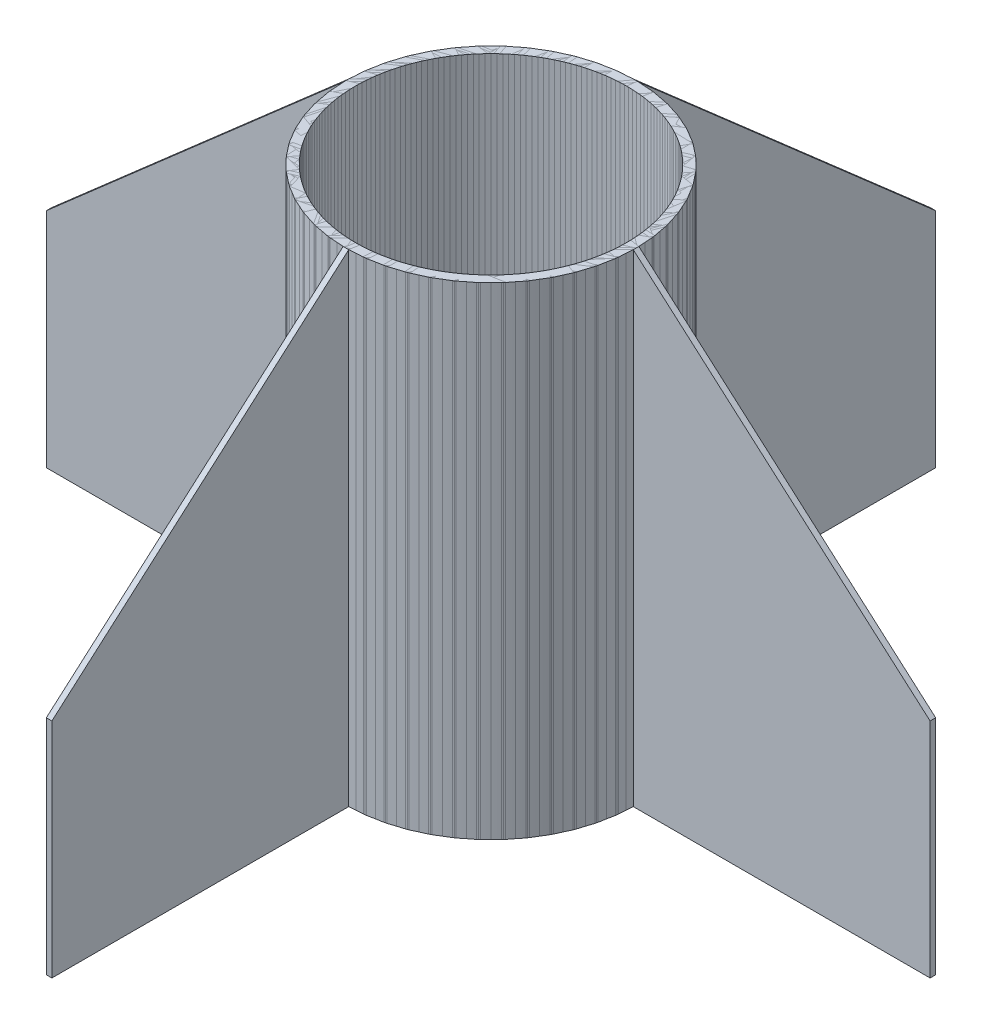
ISO-10303-21;
HEADER;
FILE_DESCRIPTION(('STEP AP214'),'2;1');
FILE_NAME('part.step','',(''),(''),'','','');
FILE_SCHEMA(('AUTOMOTIVE_DESIGN { 1 0 10303 214 1 1 1 1 }'));
ENDSEC;
DATA;
#1=APPLICATION_CONTEXT('core data for automotive mechanical design processes');
#2=APPLICATION_PROTOCOL_DEFINITION('international standard','automotive_design',2000,#1);
#3=PRODUCT_CONTEXT('',#1,'mechanical');
#4=PRODUCT('Part','Part','',(#3));
#5=PRODUCT_RELATED_PRODUCT_CATEGORY('part','',(#4));
#6=PRODUCT_DEFINITION_FORMATION('','',#4);
#7=PRODUCT_DEFINITION_CONTEXT('part definition',#1,'design');
#8=PRODUCT_DEFINITION('design','',#6,#7);
#9=PRODUCT_DEFINITION_SHAPE('','',#8);
#10=(LENGTH_UNIT() NAMED_UNIT(*) SI_UNIT(.MILLI.,.METRE.));
#11=(NAMED_UNIT(*) PLANE_ANGLE_UNIT() SI_UNIT($,.RADIAN.));
#12=(NAMED_UNIT(*) SI_UNIT($,.STERADIAN.) SOLID_ANGLE_UNIT());
#13=UNCERTAINTY_MEASURE_WITH_UNIT(LENGTH_MEASURE(1.E-05),#10,'distance_accuracy_value','');
#14=(GEOMETRIC_REPRESENTATION_CONTEXT(3) GLOBAL_UNCERTAINTY_ASSIGNED_CONTEXT((#13)) GLOBAL_UNIT_ASSIGNED_CONTEXT((#10,
#11,#12)) REPRESENTATION_CONTEXT('',''));
#15=CARTESIAN_POINT('',(0.,0.,0.));
#16=DIRECTION('',(0.,0.,1.));
#17=DIRECTION('',(1.,0.,0.));
#18=AXIS2_PLACEMENT_3D('',#15,#16,#17);
#19=CARTESIAN_POINT('',(0.,260.,0.));
#20=DIRECTION('',(0.,-1.,0.));
#21=DIRECTION('',(-1.,0.,0.));
#22=AXIS2_PLACEMENT_3D('',#19,#20,#21);
#23=CYLINDRICAL_SURFACE('',#22,78.2);
#24=DIRECTION('',(0.,-1.,0.));
#25=VECTOR('',#24,1.);
#26=CARTESIAN_POINT('',(-1.49999999999918,260.,-78.1856124872089));
#27=LINE('',#26,#25);
#28=CARTESIAN_POINT('',(-1.49999999999918,0.,-78.1856124872089));
#29=VERTEX_POINT('',#28);
#30=CARTESIAN_POINT('',(-1.49999999999918,260.,-78.1856124872089));
#31=VERTEX_POINT('',#30);
#32=EDGE_CURVE('E12',#29,#31,#27,.F.);
#33=ORIENTED_EDGE('',*,*,#32,.F.);
#34=CARTESIAN_POINT('',(0.,0.,0.));
#35=DIRECTION('',(0.,1.,0.));
#36=DIRECTION('',(1.,0.,0.));
#37=AXIS2_PLACEMENT_3D('',#34,#35,#36);
#38=CIRCLE('',#37,78.2);
#39=CARTESIAN_POINT('',(1.50000000000082,0.,-78.1856124872089));
#40=VERTEX_POINT('',#39);
#41=EDGE_CURVE('E131',#29,#40,#38,.T.);
#42=ORIENTED_EDGE('',*,*,#41,.T.);
#43=DIRECTION('',(0.,-1.,0.));
#44=VECTOR('',#43,1.);
#45=CARTESIAN_POINT('',(1.50000000000082,260.,-78.1856124872089));
#46=LINE('',#45,#44);
#47=CARTESIAN_POINT('',(1.50000000000082,260.,-78.1856124872089));
#48=VERTEX_POINT('',#47);
#49=EDGE_CURVE('E53',#40,#48,#46,.F.);
#50=ORIENTED_EDGE('',*,*,#49,.T.);
#51=CARTESIAN_POINT('',(0.,260.,0.));
#52=DIRECTION('',(0.,1.,0.));
#53=DIRECTION('',(1.,0.,0.));
#54=AXIS2_PLACEMENT_3D('',#51,#52,#53);
#55=CIRCLE('',#54,78.2);
#56=EDGE_CURVE('E134',#31,#48,#55,.T.);
#57=ORIENTED_EDGE('',*,*,#56,.F.);
#58=EDGE_LOOP('',(#33,#42,#50,#57));
#59=FACE_BOUND('',#58,.T.);
#60=ADVANCED_FACE('F46',(#59),#23,.T.);
#61=CARTESIAN_POINT('',(0.,260.,0.));
#62=DIRECTION('',(0.,1.,0.));
#63=DIRECTION('',(1.,0.,0.));
#64=AXIS2_PLACEMENT_3D('',#61,#62,#63);
#65=PLANE('',#64);
#66=DIRECTION('',(0.,0.,1.));
#67=VECTOR('',#66,1.);
#68=CARTESIAN_POINT('',(-1.49999999999918,260.,-78.2));
#69=LINE('',#68,#67);
#70=CARTESIAN_POINT('',(-1.49999999999918,260.,-78.2));
#71=VERTEX_POINT('',#70);
#72=EDGE_CURVE('E99',#71,#31,#69,.T.);
#73=ORIENTED_EDGE('',*,*,#72,.T.);
#74=ORIENTED_EDGE('',*,*,#56,.T.);
#75=DIRECTION('',(0.,0.,1.));
#76=VECTOR('',#75,1.);
#77=CARTESIAN_POINT('',(1.50000000000082,260.,-78.2));
#78=LINE('',#77,#76);
#79=CARTESIAN_POINT('',(1.50000000000082,260.,-78.2));
#80=VERTEX_POINT('',#79);
#81=EDGE_CURVE('E60',#80,#48,#78,.T.);
#82=ORIENTED_EDGE('',*,*,#81,.F.);
#83=DIRECTION('',(1.,0.,0.));
#84=VECTOR('',#83,1.);
#85=CARTESIAN_POINT('',(-1.49999999999918,260.,-78.2));
#86=LINE('',#85,#84);
#87=EDGE_CURVE('E124',#71,#80,#86,.T.);
#88=ORIENTED_EDGE('',*,*,#87,.F.);
#89=EDGE_LOOP('',(#73,#74,#82,#88));
#90=FACE_BOUND('',#89,.T.);
#91=CARTESIAN_POINT('',(0.,260.,0.));
#92=DIRECTION('',(0.,1.,0.));
#93=DIRECTION('',(1.,0.,0.));
#94=AXIS2_PLACEMENT_3D('',#91,#92,#93);
#95=CIRCLE('',#94,73.2);
#96=CARTESIAN_POINT('',(73.2,260.,7.66729302009952E-13));
#97=VERTEX_POINT('',#96);
#98=EDGE_CURVE('E128',#97,#97,#95,.T.);
#99=ORIENTED_EDGE('',*,*,#98,.F.);
#100=EDGE_LOOP('',(#99));
#101=FACE_BOUND('',#100,.T.);
#102=ADVANCED_FACE('F140',(#90,#101),#65,.T.);
#103=CARTESIAN_POINT('',(0.,0.,0.));
#104=DIRECTION('',(0.,1.,0.));
#105=DIRECTION('',(1.,0.,0.));
#106=AXIS2_PLACEMENT_3D('',#103,#104,#105);
#107=PLANE('',#106);
#108=ORIENTED_EDGE('',*,*,#41,.F.);
#109=DIRECTION('',(0.,0.,-1.));
#110=VECTOR('',#109,1.);
#111=CARTESIAN_POINT('',(-1.4999999999992,0.,-76.2));
#112=LINE('',#111,#110);
#113=CARTESIAN_POINT('',(-1.49999999999751,0.,-238.2));
#114=VERTEX_POINT('',#113);
#115=EDGE_CURVE('E67',#29,#114,#112,.T.);
#116=ORIENTED_EDGE('',*,*,#115,.T.);
#117=DIRECTION('',(1.,0.,0.));
#118=VECTOR('',#117,1.);
#119=CARTESIAN_POINT('',(-1.49999999999751,0.,-238.2));
#120=LINE('',#119,#118);
#121=CARTESIAN_POINT('',(1.50000000000249,0.,-238.2));
#122=VERTEX_POINT('',#121);
#123=EDGE_CURVE('E102',#114,#122,#120,.T.);
#124=ORIENTED_EDGE('',*,*,#123,.T.);
#125=DIRECTION('',(0.,0.,-1.));
#126=VECTOR('',#125,1.);
#127=CARTESIAN_POINT('',(1.5000000000008,0.,-76.2));
#128=LINE('',#127,#126);
#129=EDGE_CURVE('E90',#40,#122,#128,.T.);
#130=ORIENTED_EDGE('',*,*,#129,.F.);
#131=EDGE_LOOP('',(#108,#116,#124,#130));
#132=FACE_BOUND('',#131,.T.);
#133=CARTESIAN_POINT('',(0.,0.,0.));
#134=DIRECTION('',(0.,1.,0.));
#135=DIRECTION('',(1.,0.,0.));
#136=AXIS2_PLACEMENT_3D('',#133,#134,#135);
#137=CIRCLE('',#136,73.2);
#138=CARTESIAN_POINT('',(73.2,0.,7.66729302009952E-13));
#139=VERTEX_POINT('',#138);
#140=EDGE_CURVE('E127',#139,#139,#137,.T.);
#141=ORIENTED_EDGE('',*,*,#140,.T.);
#142=EDGE_LOOP('',(#141));
#143=FACE_BOUND('',#142,.T.);
#144=ADVANCED_FACE('F103',(#132,#143),#107,.F.);
#145=CARTESIAN_POINT('',(0.,260.,0.));
#146=DIRECTION('',(0.,-1.,0.));
#147=DIRECTION('',(-1.,0.,0.));
#148=AXIS2_PLACEMENT_3D('',#145,#146,#147);
#149=CYLINDRICAL_SURFACE('',#148,73.2);
#150=ORIENTED_EDGE('',*,*,#98,.T.);
#151=EDGE_LOOP('',(#150));
#152=FACE_BOUND('',#151,.T.);
#153=ORIENTED_EDGE('',*,*,#140,.F.);
#154=EDGE_LOOP('',(#153));
#155=FACE_BOUND('',#154,.T.);
#156=ADVANCED_FACE('F163',(#152,#155),#149,.F.);
#157=CARTESIAN_POINT('',(-1.5,0.,0.));
#158=DIRECTION('',(1.,0.,0.));
#159=DIRECTION('',(0.,0.,-1.));
#160=AXIS2_PLACEMENT_3D('',#157,#158,#159);
#161=PLANE('',#160);
#162=ORIENTED_EDGE('',*,*,#115,.F.);
#163=ORIENTED_EDGE('',*,*,#32,.T.);
#164=ORIENTED_EDGE('',*,*,#72,.F.);
#165=DIRECTION('',(0.,0.658504607868518,0.752576694706878));
#166=VECTOR('',#165,1.);
#167=CARTESIAN_POINT('',(-1.49999999999751,120.,-238.2));
#168=LINE('',#167,#166);
#169=CARTESIAN_POINT('',(-1.49999999999751,120.,-238.2));
#170=VERTEX_POINT('',#169);
#171=EDGE_CURVE('E108',#170,#71,#168,.T.);
#172=ORIENTED_EDGE('',*,*,#171,.F.);
#173=DIRECTION('',(0.,1.,0.));
#174=VECTOR('',#173,1.);
#175=CARTESIAN_POINT('',(-1.49999999999751,0.,-238.2));
#176=LINE('',#175,#174);
#177=EDGE_CURVE('E113',#114,#170,#176,.T.);
#178=ORIENTED_EDGE('',*,*,#177,.F.);
#179=EDGE_LOOP('',(#162,#163,#164,#172,#178));
#180=FACE_BOUND('',#179,.T.);
#181=ADVANCED_FACE('F144',(#180),#161,.F.);
#182=CARTESIAN_POINT('',(1.5,0.,0.));
#183=DIRECTION('',(1.,0.,0.));
#184=DIRECTION('',(0.,0.,-1.));
#185=AXIS2_PLACEMENT_3D('',#182,#183,#184);
#186=PLANE('',#185);
#187=ORIENTED_EDGE('',*,*,#49,.F.);
#188=ORIENTED_EDGE('',*,*,#129,.T.);
#189=DIRECTION('',(0.,1.,0.));
#190=VECTOR('',#189,1.);
#191=CARTESIAN_POINT('',(1.50000000000249,0.,-238.2));
#192=LINE('',#191,#190);
#193=CARTESIAN_POINT('',(1.50000000000249,120.,-238.2));
#194=VERTEX_POINT('',#193);
#195=EDGE_CURVE('E94',#122,#194,#192,.T.);
#196=ORIENTED_EDGE('',*,*,#195,.T.);
#197=DIRECTION('',(0.,0.658504607868518,0.752576694706878));
#198=VECTOR('',#197,1.);
#199=CARTESIAN_POINT('',(1.50000000000249,120.,-238.2));
#200=LINE('',#199,#198);
#201=EDGE_CURVE('E111',#194,#80,#200,.T.);
#202=ORIENTED_EDGE('',*,*,#201,.T.);
#203=ORIENTED_EDGE('',*,*,#81,.T.);
#204=EDGE_LOOP('',(#187,#188,#196,#202,#203));
#205=FACE_BOUND('',#204,.T.);
#206=ADVANCED_FACE('F92',(#205),#186,.T.);
#207=CARTESIAN_POINT('',(-1.49999999999751,120.,-238.2));
#208=DIRECTION('',(0.,0.752576694706878,-0.658504607868518));
#209=DIRECTION('',(0.,0.658504607868518,0.752576694706878));
#210=AXIS2_PLACEMENT_3D('',#207,#208,#209);
#211=PLANE('',#210);
#212=ORIENTED_EDGE('',*,*,#87,.T.);
#213=ORIENTED_EDGE('',*,*,#201,.F.);
#214=DIRECTION('',(1.,0.,0.));
#215=VECTOR('',#214,1.);
#216=CARTESIAN_POINT('',(-1.49999999999751,120.,-238.2));
#217=LINE('',#216,#215);
#218=EDGE_CURVE('E107',#170,#194,#217,.T.);
#219=ORIENTED_EDGE('',*,*,#218,.F.);
#220=ORIENTED_EDGE('',*,*,#171,.T.);
#221=EDGE_LOOP('',(#212,#213,#219,#220));
#222=FACE_BOUND('',#221,.T.);
#223=ADVANCED_FACE('F146',(#222),#211,.T.);
#224=CARTESIAN_POINT('',(-1.49999999999751,0.,-238.2));
#225=DIRECTION('',(0.,0.,-1.));
#226=DIRECTION('',(-1.,0.,0.));
#227=AXIS2_PLACEMENT_3D('',#224,#225,#226);
#228=PLANE('',#227);
#229=ORIENTED_EDGE('',*,*,#218,.T.);
#230=ORIENTED_EDGE('',*,*,#195,.F.);
#231=ORIENTED_EDGE('',*,*,#123,.F.);
#232=ORIENTED_EDGE('',*,*,#177,.T.);
#233=EDGE_LOOP('',(#229,#230,#231,#232));
#234=FACE_BOUND('',#233,.T.);
#235=ADVANCED_FACE('F110',(#234),#228,.T.);
#236=CLOSED_SHELL('',(#60,#102,#144,#156,#181,#206,#223,#235));
#237=MANIFOLD_SOLID_BREP('B2',#236);
#238=CARTESIAN_POINT('',(0.,260.,0.));
#239=DIRECTION('',(0.,-1.,0.));
#240=DIRECTION('',(0.,0.,1.));
#241=AXIS2_PLACEMENT_3D('',#238,#239,#240);
#242=CYLINDRICAL_SURFACE('',#241,78.2);
#243=DIRECTION('',(0.,-1.,0.));
#244=VECTOR('',#243,1.);
#245=CARTESIAN_POINT('',(-78.1856124872089,260.,1.5));
#246=LINE('',#245,#244);
#247=CARTESIAN_POINT('',(-78.1856124872089,0.,1.5));
#248=VERTEX_POINT('',#247);
#249=CARTESIAN_POINT('',(-78.1856124872089,260.,1.5));
#250=VERTEX_POINT('',#249);
#251=EDGE_CURVE('E44',#248,#250,#246,.F.);
#252=ORIENTED_EDGE('',*,*,#251,.F.);
#253=CARTESIAN_POINT('',(0.,0.,0.));
#254=DIRECTION('',(0.,1.,0.));
#255=DIRECTION('',(0.,0.,-1.));
#256=AXIS2_PLACEMENT_3D('',#253,#254,#255);
#257=CIRCLE('',#256,78.2);
#258=CARTESIAN_POINT('',(-78.1856124872089,0.,-1.5));
#259=VERTEX_POINT('',#258);
#260=EDGE_CURVE('E327',#248,#259,#257,.T.);
#261=ORIENTED_EDGE('',*,*,#260,.T.);
#262=DIRECTION('',(0.,-1.,0.));
#263=VECTOR('',#262,1.);
#264=CARTESIAN_POINT('',(-78.1856124872089,260.,-1.5));
#265=LINE('',#264,#263);
#266=CARTESIAN_POINT('',(-78.1856124872089,260.,-1.5));
#267=VERTEX_POINT('',#266);
#268=EDGE_CURVE('E249',#259,#267,#265,.F.);
#269=ORIENTED_EDGE('',*,*,#268,.T.);
#270=CARTESIAN_POINT('',(0.,260.,0.));
#271=DIRECTION('',(0.,1.,0.));
#272=DIRECTION('',(0.,0.,-1.));
#273=AXIS2_PLACEMENT_3D('',#270,#271,#272);
#274=CIRCLE('',#273,78.2);
#275=EDGE_CURVE('E330',#250,#267,#274,.T.);
#276=ORIENTED_EDGE('',*,*,#275,.F.);
#277=EDGE_LOOP('',(#252,#261,#269,#276));
#278=FACE_BOUND('',#277,.T.);
#279=ADVANCED_FACE('F242',(#278),#242,.T.);
#280=CARTESIAN_POINT('',(0.,260.,0.));
#281=DIRECTION('',(0.,1.,0.));
#282=DIRECTION('',(0.,0.,-1.));
#283=AXIS2_PLACEMENT_3D('',#280,#281,#282);
#284=PLANE('',#283);
#285=DIRECTION('',(1.,0.,0.));
#286=VECTOR('',#285,1.);
#287=CARTESIAN_POINT('',(-78.2,260.,1.5));
#288=LINE('',#287,#286);
#289=CARTESIAN_POINT('',(-78.2,260.,1.5));
#290=VERTEX_POINT('',#289);
#291=EDGE_CURVE('E295',#290,#250,#288,.T.);
#292=ORIENTED_EDGE('',*,*,#291,.T.);
#293=ORIENTED_EDGE('',*,*,#275,.T.);
#294=DIRECTION('',(1.,0.,0.));
#295=VECTOR('',#294,1.);
#296=CARTESIAN_POINT('',(-78.2,260.,-1.5));
#297=LINE('',#296,#295);
#298=CARTESIAN_POINT('',(-78.2,260.,-1.5));
#299=VERTEX_POINT('',#298);
#300=EDGE_CURVE('E256',#299,#267,#297,.T.);
#301=ORIENTED_EDGE('',*,*,#300,.F.);
#302=DIRECTION('',(0.,0.,-1.));
#303=VECTOR('',#302,1.);
#304=CARTESIAN_POINT('',(-78.2,260.,1.5));
#305=LINE('',#304,#303);
#306=EDGE_CURVE('E320',#290,#299,#305,.T.);
#307=ORIENTED_EDGE('',*,*,#306,.F.);
#308=EDGE_LOOP('',(#292,#293,#301,#307));
#309=FACE_BOUND('',#308,.T.);
#310=CARTESIAN_POINT('',(0.,260.,0.));
#311=DIRECTION('',(0.,1.,0.));
#312=DIRECTION('',(0.,0.,-1.));
#313=AXIS2_PLACEMENT_3D('',#310,#311,#312);
#314=CIRCLE('',#313,73.2);
#315=CARTESIAN_POINT('',(0.,260.,-73.2));
#316=VERTEX_POINT('',#315);
#317=EDGE_CURVE('E324',#316,#316,#314,.T.);
#318=ORIENTED_EDGE('',*,*,#317,.F.);
#319=EDGE_LOOP('',(#318));
#320=FACE_BOUND('',#319,.T.);
#321=ADVANCED_FACE('F336',(#309,#320),#284,.T.);
#322=CARTESIAN_POINT('',(0.,0.,0.));
#323=DIRECTION('',(0.,1.,0.));
#324=DIRECTION('',(0.,0.,-1.));
#325=AXIS2_PLACEMENT_3D('',#322,#323,#324);
#326=PLANE('',#325);
#327=ORIENTED_EDGE('',*,*,#260,.F.);
#328=DIRECTION('',(-1.,0.,0.));
#329=VECTOR('',#328,1.);
#330=CARTESIAN_POINT('',(-76.2,0.,1.5));
#331=LINE('',#330,#329);
#332=CARTESIAN_POINT('',(-238.2,0.,1.5));
#333=VERTEX_POINT('',#332);
#334=EDGE_CURVE('E263',#248,#333,#331,.T.);
#335=ORIENTED_EDGE('',*,*,#334,.T.);
#336=DIRECTION('',(0.,0.,-1.));
#337=VECTOR('',#336,1.);
#338=CARTESIAN_POINT('',(-238.2,0.,1.5));
#339=LINE('',#338,#337);
#340=CARTESIAN_POINT('',(-238.2,0.,-1.5));
#341=VERTEX_POINT('',#340);
#342=EDGE_CURVE('E298',#333,#341,#339,.T.);
#343=ORIENTED_EDGE('',*,*,#342,.T.);
#344=DIRECTION('',(-1.,0.,0.));
#345=VECTOR('',#344,1.);
#346=CARTESIAN_POINT('',(-76.2,0.,-1.5));
#347=LINE('',#346,#345);
#348=EDGE_CURVE('E286',#259,#341,#347,.T.);
#349=ORIENTED_EDGE('',*,*,#348,.F.);
#350=EDGE_LOOP('',(#327,#335,#343,#349));
#351=FACE_BOUND('',#350,.T.);
#352=CARTESIAN_POINT('',(0.,0.,0.));
#353=DIRECTION('',(0.,1.,0.));
#354=DIRECTION('',(0.,0.,-1.));
#355=AXIS2_PLACEMENT_3D('',#352,#353,#354);
#356=CIRCLE('',#355,73.2);
#357=CARTESIAN_POINT('',(0.,0.,-73.2));
#358=VERTEX_POINT('',#357);
#359=EDGE_CURVE('E323',#358,#358,#356,.T.);
#360=ORIENTED_EDGE('',*,*,#359,.T.);
#361=EDGE_LOOP('',(#360));
#362=FACE_BOUND('',#361,.T.);
#363=ADVANCED_FACE('F299',(#351,#362),#326,.F.);
#364=CARTESIAN_POINT('',(0.,260.,0.));
#365=DIRECTION('',(0.,-1.,0.));
#366=DIRECTION('',(0.,0.,1.));
#367=AXIS2_PLACEMENT_3D('',#364,#365,#366);
#368=CYLINDRICAL_SURFACE('',#367,73.2);
#369=ORIENTED_EDGE('',*,*,#317,.T.);
#370=EDGE_LOOP('',(#369));
#371=FACE_BOUND('',#370,.T.);
#372=ORIENTED_EDGE('',*,*,#359,.F.);
#373=EDGE_LOOP('',(#372));
#374=FACE_BOUND('',#373,.T.);
#375=ADVANCED_FACE('F359',(#371,#374),#368,.F.);
#376=CARTESIAN_POINT('',(0.,0.,1.5));
#377=DIRECTION('',(0.,0.,-1.));
#378=DIRECTION('',(-1.,0.,0.));
#379=AXIS2_PLACEMENT_3D('',#376,#377,#378);
#380=PLANE('',#379);
#381=ORIENTED_EDGE('',*,*,#334,.F.);
#382=ORIENTED_EDGE('',*,*,#251,.T.);
#383=ORIENTED_EDGE('',*,*,#291,.F.);
#384=DIRECTION('',(0.752576694706878,0.658504607868518,0.));
#385=VECTOR('',#384,1.);
#386=CARTESIAN_POINT('',(-238.2,120.,1.5));
#387=LINE('',#386,#385);
#388=CARTESIAN_POINT('',(-238.2,120.,1.5));
#389=VERTEX_POINT('',#388);
#390=EDGE_CURVE('E304',#389,#290,#387,.T.);
#391=ORIENTED_EDGE('',*,*,#390,.F.);
#392=DIRECTION('',(0.,1.,0.));
#393=VECTOR('',#392,1.);
#394=CARTESIAN_POINT('',(-238.2,0.,1.5));
#395=LINE('',#394,#393);
#396=EDGE_CURVE('E309',#333,#389,#395,.T.);
#397=ORIENTED_EDGE('',*,*,#396,.F.);
#398=EDGE_LOOP('',(#381,#382,#383,#391,#397));
#399=FACE_BOUND('',#398,.T.);
#400=ADVANCED_FACE('F340',(#399),#380,.F.);
#401=CARTESIAN_POINT('',(0.,0.,-1.5));
#402=DIRECTION('',(0.,0.,-1.));
#403=DIRECTION('',(-1.,0.,0.));
#404=AXIS2_PLACEMENT_3D('',#401,#402,#403);
#405=PLANE('',#404);
#406=ORIENTED_EDGE('',*,*,#268,.F.);
#407=ORIENTED_EDGE('',*,*,#348,.T.);
#408=DIRECTION('',(0.,1.,0.));
#409=VECTOR('',#408,1.);
#410=CARTESIAN_POINT('',(-238.2,0.,-1.5));
#411=LINE('',#410,#409);
#412=CARTESIAN_POINT('',(-238.2,120.,-1.5));
#413=VERTEX_POINT('',#412);
#414=EDGE_CURVE('E290',#341,#413,#411,.T.);
#415=ORIENTED_EDGE('',*,*,#414,.T.);
#416=DIRECTION('',(0.752576694706878,0.658504607868518,0.));
#417=VECTOR('',#416,1.);
#418=CARTESIAN_POINT('',(-238.2,120.,-1.5));
#419=LINE('',#418,#417);
#420=EDGE_CURVE('E307',#413,#299,#419,.T.);
#421=ORIENTED_EDGE('',*,*,#420,.T.);
#422=ORIENTED_EDGE('',*,*,#300,.T.);
#423=EDGE_LOOP('',(#406,#407,#415,#421,#422));
#424=FACE_BOUND('',#423,.T.);
#425=ADVANCED_FACE('F288',(#424),#405,.T.);
#426=CARTESIAN_POINT('',(-238.2,120.,1.5));
#427=DIRECTION('',(-0.658504607868518,0.752576694706878,0.));
#428=DIRECTION('',(0.752576694706878,0.658504607868518,0.));
#429=AXIS2_PLACEMENT_3D('',#426,#427,#428);
#430=PLANE('',#429);
#431=ORIENTED_EDGE('',*,*,#306,.T.);
#432=ORIENTED_EDGE('',*,*,#420,.F.);
#433=DIRECTION('',(0.,0.,-1.));
#434=VECTOR('',#433,1.);
#435=CARTESIAN_POINT('',(-238.2,120.,1.5));
#436=LINE('',#435,#434);
#437=EDGE_CURVE('E303',#389,#413,#436,.T.);
#438=ORIENTED_EDGE('',*,*,#437,.F.);
#439=ORIENTED_EDGE('',*,*,#390,.T.);
#440=EDGE_LOOP('',(#431,#432,#438,#439));
#441=FACE_BOUND('',#440,.T.);
#442=ADVANCED_FACE('F342',(#441),#430,.T.);
#443=CARTESIAN_POINT('',(-238.2,0.,1.5));
#444=DIRECTION('',(-1.,0.,0.));
#445=DIRECTION('',(0.,0.,1.));
#446=AXIS2_PLACEMENT_3D('',#443,#444,#445);
#447=PLANE('',#446);
#448=ORIENTED_EDGE('',*,*,#437,.T.);
#449=ORIENTED_EDGE('',*,*,#414,.F.);
#450=ORIENTED_EDGE('',*,*,#342,.F.);
#451=ORIENTED_EDGE('',*,*,#396,.T.);
#452=EDGE_LOOP('',(#448,#449,#450,#451));
#453=FACE_BOUND('',#452,.T.);
#454=ADVANCED_FACE('F306',(#453),#447,.T.);
#455=CLOSED_SHELL('',(#279,#321,#363,#375,#400,#425,#442,#454));
#456=MANIFOLD_SOLID_BREP('B6',#455);
#457=CARTESIAN_POINT('',(0.,260.,0.));
#458=DIRECTION('',(0.,-1.,0.));
#459=DIRECTION('',(1.,0.,0.));
#460=AXIS2_PLACEMENT_3D('',#457,#458,#459);
#461=CYLINDRICAL_SURFACE('',#460,78.2);
#462=DIRECTION('',(0.,-1.,0.));
#463=VECTOR('',#462,1.);
#464=CARTESIAN_POINT('',(1.49999999999973,260.,78.1856124872089));
#465=LINE('',#464,#463);
#466=CARTESIAN_POINT('',(1.49999999999973,0.,78.1856124872089));
#467=VERTEX_POINT('',#466);
#468=CARTESIAN_POINT('',(1.49999999999973,260.,78.1856124872089));
#469=VERTEX_POINT('',#468);
#470=EDGE_CURVE('E240',#467,#469,#465,.F.);
#471=ORIENTED_EDGE('',*,*,#470,.F.);
#472=CARTESIAN_POINT('',(0.,0.,0.));
#473=DIRECTION('',(0.,1.,0.));
#474=DIRECTION('',(-1.,0.,0.));
#475=AXIS2_PLACEMENT_3D('',#472,#473,#474);
#476=CIRCLE('',#475,78.2);
#477=CARTESIAN_POINT('',(-1.50000000000027,0.,78.1856124872089));
#478=VERTEX_POINT('',#477);
#479=EDGE_CURVE('E522',#467,#478,#476,.T.);
#480=ORIENTED_EDGE('',*,*,#479,.T.);
#481=DIRECTION('',(0.,-1.,0.));
#482=VECTOR('',#481,1.);
#483=CARTESIAN_POINT('',(-1.50000000000027,260.,78.1856124872089));
#484=LINE('',#483,#482);
#485=CARTESIAN_POINT('',(-1.50000000000027,260.,78.1856124872089));
#486=VERTEX_POINT('',#485);
#487=EDGE_CURVE('E444',#478,#486,#484,.F.);
#488=ORIENTED_EDGE('',*,*,#487,.T.);
#489=CARTESIAN_POINT('',(0.,260.,0.));
#490=DIRECTION('',(0.,1.,0.));
#491=DIRECTION('',(-1.,0.,0.));
#492=AXIS2_PLACEMENT_3D('',#489,#490,#491);
#493=CIRCLE('',#492,78.2);
#494=EDGE_CURVE('E525',#469,#486,#493,.T.);
#495=ORIENTED_EDGE('',*,*,#494,.F.);
#496=EDGE_LOOP('',(#471,#480,#488,#495));
#497=FACE_BOUND('',#496,.T.);
#498=ADVANCED_FACE('F437',(#497),#461,.T.);
#499=CARTESIAN_POINT('',(0.,260.,0.));
#500=DIRECTION('',(0.,1.,0.));
#501=DIRECTION('',(-1.,0.,0.));
#502=AXIS2_PLACEMENT_3D('',#499,#500,#501);
#503=PLANE('',#502);
#504=DIRECTION('',(0.,0.,-1.));
#505=VECTOR('',#504,1.);
#506=CARTESIAN_POINT('',(1.49999999999973,260.,78.2));
#507=LINE('',#506,#505);
#508=CARTESIAN_POINT('',(1.49999999999973,260.,78.2));
#509=VERTEX_POINT('',#508);
#510=EDGE_CURVE('E490',#509,#469,#507,.T.);
#511=ORIENTED_EDGE('',*,*,#510,.T.);
#512=ORIENTED_EDGE('',*,*,#494,.T.);
#513=DIRECTION('',(0.,0.,-1.));
#514=VECTOR('',#513,1.);
#515=CARTESIAN_POINT('',(-1.50000000000027,260.,78.2));
#516=LINE('',#515,#514);
#517=CARTESIAN_POINT('',(-1.50000000000027,260.,78.2));
#518=VERTEX_POINT('',#517);
#519=EDGE_CURVE('E451',#518,#486,#516,.T.);
#520=ORIENTED_EDGE('',*,*,#519,.F.);
#521=DIRECTION('',(-1.,0.,0.));
#522=VECTOR('',#521,1.);
#523=CARTESIAN_POINT('',(1.49999999999973,260.,78.2));
#524=LINE('',#523,#522);
#525=EDGE_CURVE('E515',#509,#518,#524,.T.);
#526=ORIENTED_EDGE('',*,*,#525,.F.);
#527=EDGE_LOOP('',(#511,#512,#520,#526));
#528=FACE_BOUND('',#527,.T.);
#529=CARTESIAN_POINT('',(0.,260.,0.));
#530=DIRECTION('',(0.,1.,0.));
#531=DIRECTION('',(-1.,0.,0.));
#532=AXIS2_PLACEMENT_3D('',#529,#530,#531);
#533=CIRCLE('',#532,73.2);
#534=CARTESIAN_POINT('',(-73.2,260.,-2.55576434003317E-13));
#535=VERTEX_POINT('',#534);
#536=EDGE_CURVE('E519',#535,#535,#533,.T.);
#537=ORIENTED_EDGE('',*,*,#536,.F.);
#538=EDGE_LOOP('',(#537));
#539=FACE_BOUND('',#538,.T.);
#540=ADVANCED_FACE('F531',(#528,#539),#503,.T.);
#541=CARTESIAN_POINT('',(0.,0.,0.));
#542=DIRECTION('',(0.,1.,0.));
#543=DIRECTION('',(-1.,0.,0.));
#544=AXIS2_PLACEMENT_3D('',#541,#542,#543);
#545=PLANE('',#544);
#546=ORIENTED_EDGE('',*,*,#479,.F.);
#547=DIRECTION('',(0.,0.,1.));
#548=VECTOR('',#547,1.);
#549=CARTESIAN_POINT('',(1.49999999999973,0.,76.2));
#550=LINE('',#549,#548);
#551=CARTESIAN_POINT('',(1.49999999999917,0.,238.2));
#552=VERTEX_POINT('',#551);
#553=EDGE_CURVE('E458',#467,#552,#550,.T.);
#554=ORIENTED_EDGE('',*,*,#553,.T.);
#555=DIRECTION('',(-1.,0.,0.));
#556=VECTOR('',#555,1.);
#557=CARTESIAN_POINT('',(1.49999999999917,0.,238.2));
#558=LINE('',#557,#556);
#559=CARTESIAN_POINT('',(-1.50000000000083,0.,238.2));
#560=VERTEX_POINT('',#559);
#561=EDGE_CURVE('E493',#552,#560,#558,.T.);
#562=ORIENTED_EDGE('',*,*,#561,.T.);
#563=DIRECTION('',(0.,0.,1.));
#564=VECTOR('',#563,1.);
#565=CARTESIAN_POINT('',(-1.50000000000027,0.,76.2));
#566=LINE('',#565,#564);
#567=EDGE_CURVE('E481',#478,#560,#566,.T.);
#568=ORIENTED_EDGE('',*,*,#567,.F.);
#569=EDGE_LOOP('',(#546,#554,#562,#568));
#570=FACE_BOUND('',#569,.T.);
#571=CARTESIAN_POINT('',(0.,0.,0.));
#572=DIRECTION('',(0.,1.,0.));
#573=DIRECTION('',(-1.,0.,0.));
#574=AXIS2_PLACEMENT_3D('',#571,#572,#573);
#575=CIRCLE('',#574,73.2);
#576=CARTESIAN_POINT('',(-73.2,0.,-2.55576434003317E-13));
#577=VERTEX_POINT('',#576);
#578=EDGE_CURVE('E518',#577,#577,#575,.T.);
#579=ORIENTED_EDGE('',*,*,#578,.T.);
#580=EDGE_LOOP('',(#579));
#581=FACE_BOUND('',#580,.T.);
#582=ADVANCED_FACE('F494',(#570,#581),#545,.F.);
#583=CARTESIAN_POINT('',(0.,260.,0.));
#584=DIRECTION('',(0.,-1.,0.));
#585=DIRECTION('',(1.,0.,0.));
#586=AXIS2_PLACEMENT_3D('',#583,#584,#585);
#587=CYLINDRICAL_SURFACE('',#586,73.2);
#588=ORIENTED_EDGE('',*,*,#536,.T.);
#589=EDGE_LOOP('',(#588));
#590=FACE_BOUND('',#589,.T.);
#591=ORIENTED_EDGE('',*,*,#578,.F.);
#592=EDGE_LOOP('',(#591));
#593=FACE_BOUND('',#592,.T.);
#594=ADVANCED_FACE('F554',(#590,#593),#587,.F.);
#595=CARTESIAN_POINT('',(1.5,0.,0.));
#596=DIRECTION('',(-1.,0.,0.));
#597=DIRECTION('',(0.,0.,1.));
#598=AXIS2_PLACEMENT_3D('',#595,#596,#597);
#599=PLANE('',#598);
#600=ORIENTED_EDGE('',*,*,#553,.F.);
#601=ORIENTED_EDGE('',*,*,#470,.T.);
#602=ORIENTED_EDGE('',*,*,#510,.F.);
#603=DIRECTION('',(0.,0.658504607868518,-0.752576694706878));
#604=VECTOR('',#603,1.);
#605=CARTESIAN_POINT('',(1.49999999999917,120.,238.2));
#606=LINE('',#605,#604);
#607=CARTESIAN_POINT('',(1.49999999999917,120.,238.2));
#608=VERTEX_POINT('',#607);
#609=EDGE_CURVE('E499',#608,#509,#606,.T.);
#610=ORIENTED_EDGE('',*,*,#609,.F.);
#611=DIRECTION('',(0.,1.,0.));
#612=VECTOR('',#611,1.);
#613=CARTESIAN_POINT('',(1.49999999999917,0.,238.2));
#614=LINE('',#613,#612);
#615=EDGE_CURVE('E504',#552,#608,#614,.T.);
#616=ORIENTED_EDGE('',*,*,#615,.F.);
#617=EDGE_LOOP('',(#600,#601,#602,#610,#616));
#618=FACE_BOUND('',#617,.T.);
#619=ADVANCED_FACE('F535',(#618),#599,.F.);
#620=CARTESIAN_POINT('',(-1.5,0.,0.));
#621=DIRECTION('',(-1.,0.,0.));
#622=DIRECTION('',(0.,0.,1.));
#623=AXIS2_PLACEMENT_3D('',#620,#621,#622);
#624=PLANE('',#623);
#625=ORIENTED_EDGE('',*,*,#487,.F.);
#626=ORIENTED_EDGE('',*,*,#567,.T.);
#627=DIRECTION('',(0.,1.,0.));
#628=VECTOR('',#627,1.);
#629=CARTESIAN_POINT('',(-1.50000000000083,0.,238.2));
#630=LINE('',#629,#628);
#631=CARTESIAN_POINT('',(-1.50000000000083,120.,238.2));
#632=VERTEX_POINT('',#631);
#633=EDGE_CURVE('E485',#560,#632,#630,.T.);
#634=ORIENTED_EDGE('',*,*,#633,.T.);
#635=DIRECTION('',(0.,0.658504607868518,-0.752576694706878));
#636=VECTOR('',#635,1.);
#637=CARTESIAN_POINT('',(-1.50000000000083,120.,238.2));
#638=LINE('',#637,#636);
#639=EDGE_CURVE('E502',#632,#518,#638,.T.);
#640=ORIENTED_EDGE('',*,*,#639,.T.);
#641=ORIENTED_EDGE('',*,*,#519,.T.);
#642=EDGE_LOOP('',(#625,#626,#634,#640,#641));
#643=FACE_BOUND('',#642,.T.);
#644=ADVANCED_FACE('F483',(#643),#624,.T.);
#645=CARTESIAN_POINT('',(1.49999999999917,120.,238.2));
#646=DIRECTION('',(0.,0.752576694706878,0.658504607868518));
#647=DIRECTION('',(0.,0.658504607868518,-0.752576694706878));
#648=AXIS2_PLACEMENT_3D('',#645,#646,#647);
#649=PLANE('',#648);
#650=ORIENTED_EDGE('',*,*,#525,.T.);
#651=ORIENTED_EDGE('',*,*,#639,.F.);
#652=DIRECTION('',(-1.,0.,0.));
#653=VECTOR('',#652,1.);
#654=CARTESIAN_POINT('',(1.49999999999917,120.,238.2));
#655=LINE('',#654,#653);
#656=EDGE_CURVE('E498',#608,#632,#655,.T.);
#657=ORIENTED_EDGE('',*,*,#656,.F.);
#658=ORIENTED_EDGE('',*,*,#609,.T.);
#659=EDGE_LOOP('',(#650,#651,#657,#658));
#660=FACE_BOUND('',#659,.T.);
#661=ADVANCED_FACE('F537',(#660),#649,.T.);
#662=CARTESIAN_POINT('',(1.49999999999917,0.,238.2));
#663=DIRECTION('',(0.,0.,1.));
#664=DIRECTION('',(1.,0.,0.));
#665=AXIS2_PLACEMENT_3D('',#662,#663,#664);
#666=PLANE('',#665);
#667=ORIENTED_EDGE('',*,*,#656,.T.);
#668=ORIENTED_EDGE('',*,*,#633,.F.);
#669=ORIENTED_EDGE('',*,*,#561,.F.);
#670=ORIENTED_EDGE('',*,*,#615,.T.);
#671=EDGE_LOOP('',(#667,#668,#669,#670));
#672=FACE_BOUND('',#671,.T.);
#673=ADVANCED_FACE('F501',(#672),#666,.T.);
#674=CLOSED_SHELL('',(#498,#540,#582,#594,#619,#644,#661,#673));
#675=MANIFOLD_SOLID_BREP('B38',#674);
#676=CARTESIAN_POINT('',(0.,260.,0.));
#677=DIRECTION('',(0.,-1.,0.));
#678=DIRECTION('',(0.,0.,-1.));
#679=AXIS2_PLACEMENT_3D('',#676,#677,#678);
#680=CYLINDRICAL_SURFACE('',#679,78.2);
#681=DIRECTION('',(0.,-1.,0.));
#682=VECTOR('',#681,1.);
#683=CARTESIAN_POINT('',(78.1856124872089,260.,-1.5));
#684=LINE('',#683,#682);
#685=CARTESIAN_POINT('',(78.1856124872089,0.,-1.5));
#686=VERTEX_POINT('',#685);
#687=CARTESIAN_POINT('',(78.1856124872089,260.,-1.5));
#688=VERTEX_POINT('',#687);
#689=EDGE_CURVE('E435',#686,#688,#684,.F.);
#690=ORIENTED_EDGE('',*,*,#689,.F.);
#691=CARTESIAN_POINT('',(0.,0.,0.));
#692=DIRECTION('',(0.,1.,0.));
#693=DIRECTION('',(0.,0.,1.));
#694=AXIS2_PLACEMENT_3D('',#691,#692,#693);
#695=CIRCLE('',#694,78.2);
#696=CARTESIAN_POINT('',(78.1856124872089,0.,1.5));
#697=VERTEX_POINT('',#696);
#698=EDGE_CURVE('E708',#686,#697,#695,.T.);
#699=ORIENTED_EDGE('',*,*,#698,.T.);
#700=DIRECTION('',(0.,-1.,0.));
#701=VECTOR('',#700,1.);
#702=CARTESIAN_POINT('',(78.1856124872089,260.,1.5));
#703=LINE('',#702,#701);
#704=CARTESIAN_POINT('',(78.1856124872089,260.,1.5));
#705=VERTEX_POINT('',#704);
#706=EDGE_CURVE('E630',#697,#705,#703,.F.);
#707=ORIENTED_EDGE('',*,*,#706,.T.);
#708=CARTESIAN_POINT('',(0.,260.,0.));
#709=DIRECTION('',(0.,1.,0.));
#710=DIRECTION('',(0.,0.,1.));
#711=AXIS2_PLACEMENT_3D('',#708,#709,#710);
#712=CIRCLE('',#711,78.2);
#713=EDGE_CURVE('E711',#688,#705,#712,.T.);
#714=ORIENTED_EDGE('',*,*,#713,.F.);
#715=EDGE_LOOP('',(#690,#699,#707,#714));
#716=FACE_BOUND('',#715,.T.);
#717=ADVANCED_FACE('F623',(#716),#680,.T.);
#718=CARTESIAN_POINT('',(0.,260.,0.));
#719=DIRECTION('',(0.,1.,0.));
#720=DIRECTION('',(0.,0.,1.));
#721=AXIS2_PLACEMENT_3D('',#718,#719,#720);
#722=PLANE('',#721);
#723=DIRECTION('',(-1.,0.,0.));
#724=VECTOR('',#723,1.);
#725=CARTESIAN_POINT('',(78.2,260.,-1.5));
#726=LINE('',#725,#724);
#727=CARTESIAN_POINT('',(78.2,260.,-1.5));
#728=VERTEX_POINT('',#727);
#729=EDGE_CURVE('E676',#728,#688,#726,.T.);
#730=ORIENTED_EDGE('',*,*,#729,.T.);
#731=ORIENTED_EDGE('',*,*,#713,.T.);
#732=DIRECTION('',(-1.,0.,0.));
#733=VECTOR('',#732,1.);
#734=CARTESIAN_POINT('',(78.2,260.,1.5));
#735=LINE('',#734,#733);
#736=CARTESIAN_POINT('',(78.2,260.,1.5));
#737=VERTEX_POINT('',#736);
#738=EDGE_CURVE('E637',#737,#705,#735,.T.);
#739=ORIENTED_EDGE('',*,*,#738,.F.);
#740=DIRECTION('',(0.,0.,1.));
#741=VECTOR('',#740,1.);
#742=CARTESIAN_POINT('',(78.2,260.,-1.5));
#743=LINE('',#742,#741);
#744=EDGE_CURVE('E701',#728,#737,#743,.T.);
#745=ORIENTED_EDGE('',*,*,#744,.F.);
#746=EDGE_LOOP('',(#730,#731,#739,#745));
#747=FACE_BOUND('',#746,.T.);
#748=CARTESIAN_POINT('',(0.,260.,0.));
#749=DIRECTION('',(0.,1.,0.));
#750=DIRECTION('',(0.,0.,1.));
#751=AXIS2_PLACEMENT_3D('',#748,#749,#750);
#752=CIRCLE('',#751,73.2);
#753=CARTESIAN_POINT('',(0.,260.,73.2));
#754=VERTEX_POINT('',#753);
#755=EDGE_CURVE('E705',#754,#754,#752,.T.);
#756=ORIENTED_EDGE('',*,*,#755,.F.);
#757=EDGE_LOOP('',(#756));
#758=FACE_BOUND('',#757,.T.);
#759=ADVANCED_FACE('F717',(#747,#758),#722,.T.);
#760=CARTESIAN_POINT('',(0.,0.,0.));
#761=DIRECTION('',(0.,1.,0.));
#762=DIRECTION('',(0.,0.,1.));
#763=AXIS2_PLACEMENT_3D('',#760,#761,#762);
#764=PLANE('',#763);
#765=ORIENTED_EDGE('',*,*,#698,.F.);
#766=DIRECTION('',(1.,0.,0.));
#767=VECTOR('',#766,1.);
#768=CARTESIAN_POINT('',(76.2,0.,-1.5));
#769=LINE('',#768,#767);
#770=CARTESIAN_POINT('',(238.2,0.,-1.5));
#771=VERTEX_POINT('',#770);
#772=EDGE_CURVE('E644',#686,#771,#769,.T.);
#773=ORIENTED_EDGE('',*,*,#772,.T.);
#774=DIRECTION('',(0.,0.,1.));
#775=VECTOR('',#774,1.);
#776=CARTESIAN_POINT('',(238.2,0.,-1.5));
#777=LINE('',#776,#775);
#778=CARTESIAN_POINT('',(238.2,0.,1.5));
#779=VERTEX_POINT('',#778);
#780=EDGE_CURVE('E679',#771,#779,#777,.T.);
#781=ORIENTED_EDGE('',*,*,#780,.T.);
#782=DIRECTION('',(1.,0.,0.));
#783=VECTOR('',#782,1.);
#784=CARTESIAN_POINT('',(76.2,0.,1.5));
#785=LINE('',#784,#783);
#786=EDGE_CURVE('E667',#697,#779,#785,.T.);
#787=ORIENTED_EDGE('',*,*,#786,.F.);
#788=EDGE_LOOP('',(#765,#773,#781,#787));
#789=FACE_BOUND('',#788,.T.);
#790=CARTESIAN_POINT('',(0.,0.,0.));
#791=DIRECTION('',(0.,1.,0.));
#792=DIRECTION('',(0.,0.,1.));
#793=AXIS2_PLACEMENT_3D('',#790,#791,#792);
#794=CIRCLE('',#793,73.2);
#795=CARTESIAN_POINT('',(0.,0.,73.2));
#796=VERTEX_POINT('',#795);
#797=EDGE_CURVE('E704',#796,#796,#794,.T.);
#798=ORIENTED_EDGE('',*,*,#797,.T.);
#799=EDGE_LOOP('',(#798));
#800=FACE_BOUND('',#799,.T.);
#801=ADVANCED_FACE('F680',(#789,#800),#764,.F.);
#802=CARTESIAN_POINT('',(0.,260.,0.));
#803=DIRECTION('',(0.,-1.,0.));
#804=DIRECTION('',(0.,0.,-1.));
#805=AXIS2_PLACEMENT_3D('',#802,#803,#804);
#806=CYLINDRICAL_SURFACE('',#805,73.2);
#807=ORIENTED_EDGE('',*,*,#755,.T.);
#808=EDGE_LOOP('',(#807));
#809=FACE_BOUND('',#808,.T.);
#810=ORIENTED_EDGE('',*,*,#797,.F.);
#811=EDGE_LOOP('',(#810));
#812=FACE_BOUND('',#811,.T.);
#813=ADVANCED_FACE('F740',(#809,#812),#806,.F.);
#814=CARTESIAN_POINT('',(0.,0.,-1.5));
#815=DIRECTION('',(0.,0.,1.));
#816=DIRECTION('',(1.,0.,0.));
#817=AXIS2_PLACEMENT_3D('',#814,#815,#816);
#818=PLANE('',#817);
#819=ORIENTED_EDGE('',*,*,#772,.F.);
#820=ORIENTED_EDGE('',*,*,#689,.T.);
#821=ORIENTED_EDGE('',*,*,#729,.F.);
#822=DIRECTION('',(-0.752576694706878,0.658504607868518,0.));
#823=VECTOR('',#822,1.);
#824=CARTESIAN_POINT('',(238.2,120.,-1.5));
#825=LINE('',#824,#823);
#826=CARTESIAN_POINT('',(238.2,120.,-1.5));
#827=VERTEX_POINT('',#826);
#828=EDGE_CURVE('E685',#827,#728,#825,.T.);
#829=ORIENTED_EDGE('',*,*,#828,.F.);
#830=DIRECTION('',(0.,1.,0.));
#831=VECTOR('',#830,1.);
#832=CARTESIAN_POINT('',(238.2,0.,-1.5));
#833=LINE('',#832,#831);
#834=EDGE_CURVE('E690',#771,#827,#833,.T.);
#835=ORIENTED_EDGE('',*,*,#834,.F.);
#836=EDGE_LOOP('',(#819,#820,#821,#829,#835));
#837=FACE_BOUND('',#836,.T.);
#838=ADVANCED_FACE('F721',(#837),#818,.F.);
#839=CARTESIAN_POINT('',(0.,0.,1.5));
#840=DIRECTION('',(0.,0.,1.));
#841=DIRECTION('',(1.,0.,0.));
#842=AXIS2_PLACEMENT_3D('',#839,#840,#841);
#843=PLANE('',#842);
#844=ORIENTED_EDGE('',*,*,#706,.F.);
#845=ORIENTED_EDGE('',*,*,#786,.T.);
#846=DIRECTION('',(0.,1.,0.));
#847=VECTOR('',#846,1.);
#848=CARTESIAN_POINT('',(238.2,0.,1.5));
#849=LINE('',#848,#847);
#850=CARTESIAN_POINT('',(238.2,120.,1.5));
#851=VERTEX_POINT('',#850);
#852=EDGE_CURVE('E671',#779,#851,#849,.T.);
#853=ORIENTED_EDGE('',*,*,#852,.T.);
#854=DIRECTION('',(-0.752576694706878,0.658504607868518,0.));
#855=VECTOR('',#854,1.);
#856=CARTESIAN_POINT('',(238.2,120.,1.5));
#857=LINE('',#856,#855);
#858=EDGE_CURVE('E688',#851,#737,#857,.T.);
#859=ORIENTED_EDGE('',*,*,#858,.T.);
#860=ORIENTED_EDGE('',*,*,#738,.T.);
#861=EDGE_LOOP('',(#844,#845,#853,#859,#860));
#862=FACE_BOUND('',#861,.T.);
#863=ADVANCED_FACE('F669',(#862),#843,.T.);
#864=CARTESIAN_POINT('',(238.2,120.,-1.5));
#865=DIRECTION('',(0.658504607868518,0.752576694706878,0.));
#866=DIRECTION('',(-0.752576694706878,0.658504607868518,0.));
#867=AXIS2_PLACEMENT_3D('',#864,#865,#866);
#868=PLANE('',#867);
#869=ORIENTED_EDGE('',*,*,#744,.T.);
#870=ORIENTED_EDGE('',*,*,#858,.F.);
#871=DIRECTION('',(0.,0.,1.));
#872=VECTOR('',#871,1.);
#873=CARTESIAN_POINT('',(238.2,120.,-1.5));
#874=LINE('',#873,#872);
#875=EDGE_CURVE('E684',#827,#851,#874,.T.);
#876=ORIENTED_EDGE('',*,*,#875,.F.);
#877=ORIENTED_EDGE('',*,*,#828,.T.);
#878=EDGE_LOOP('',(#869,#870,#876,#877));
#879=FACE_BOUND('',#878,.T.);
#880=ADVANCED_FACE('F723',(#879),#868,.T.);
#881=CARTESIAN_POINT('',(238.2,0.,-1.5));
#882=DIRECTION('',(1.,0.,0.));
#883=DIRECTION('',(0.,0.,-1.));
#884=AXIS2_PLACEMENT_3D('',#881,#882,#883);
#885=PLANE('',#884);
#886=ORIENTED_EDGE('',*,*,#875,.T.);
#887=ORIENTED_EDGE('',*,*,#852,.F.);
#888=ORIENTED_EDGE('',*,*,#780,.F.);
#889=ORIENTED_EDGE('',*,*,#834,.T.);
#890=EDGE_LOOP('',(#886,#887,#888,#889));
#891=FACE_BOUND('',#890,.T.);
#892=ADVANCED_FACE('F687',(#891),#885,.T.);
#893=CLOSED_SHELL('',(#717,#759,#801,#813,#838,#863,#880,#892));
#894=MANIFOLD_SOLID_BREP('B234',#893);
#895=ADVANCED_BREP_SHAPE_REPRESENTATION('',(#18,#237,#456,#675,#894),#14);
#896=SHAPE_DEFINITION_REPRESENTATION(#9,#895);
ENDSEC;
END-ISO-10303-21;
